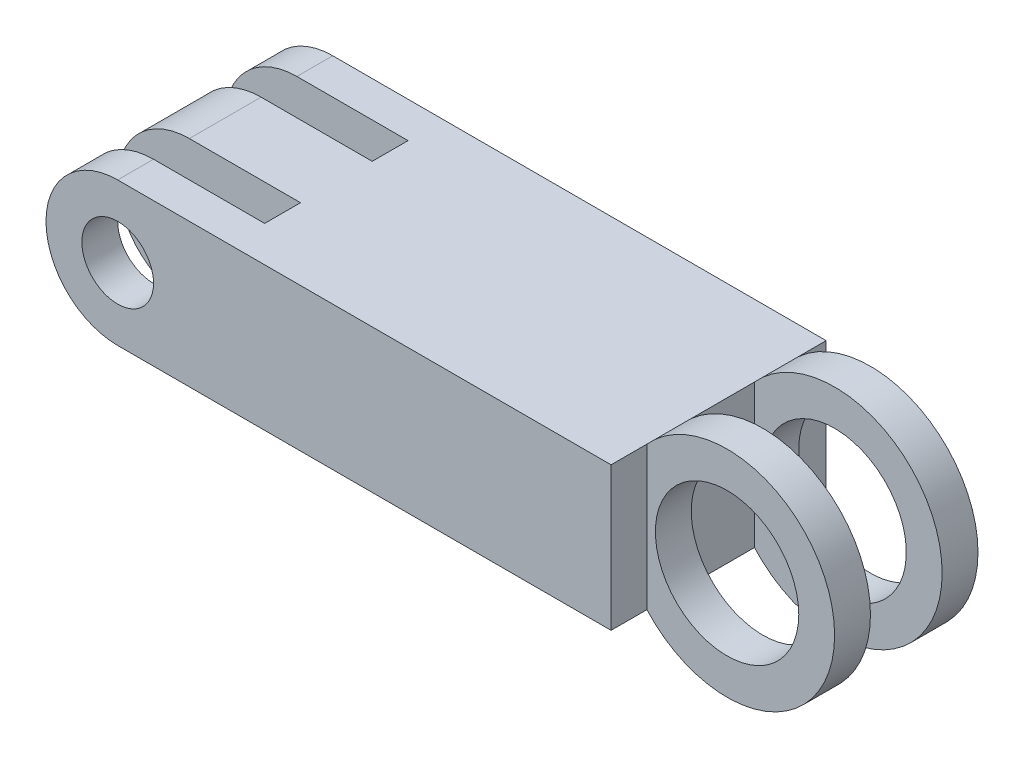
ISO-10303-21;
HEADER;
FILE_DESCRIPTION(('STEP AP214'),'2;1');
FILE_NAME('part.step','',(''),(''),'','','');
FILE_SCHEMA(('AUTOMOTIVE_DESIGN { 1 0 10303 214 1 1 1 1 }'));
ENDSEC;
DATA;
#1=APPLICATION_CONTEXT('core data for automotive mechanical design processes');
#2=APPLICATION_PROTOCOL_DEFINITION('international standard','automotive_design',2000,#1);
#3=PRODUCT_CONTEXT('',#1,'mechanical');
#4=PRODUCT('Part','Part','',(#3));
#5=PRODUCT_RELATED_PRODUCT_CATEGORY('part','',(#4));
#6=PRODUCT_DEFINITION_FORMATION('','',#4);
#7=PRODUCT_DEFINITION_CONTEXT('part definition',#1,'design');
#8=PRODUCT_DEFINITION('design','',#6,#7);
#9=PRODUCT_DEFINITION_SHAPE('','',#8);
#10=(LENGTH_UNIT() NAMED_UNIT(*) SI_UNIT(.MILLI.,.METRE.));
#11=(NAMED_UNIT(*) PLANE_ANGLE_UNIT() SI_UNIT($,.RADIAN.));
#12=(NAMED_UNIT(*) SI_UNIT($,.STERADIAN.) SOLID_ANGLE_UNIT());
#13=UNCERTAINTY_MEASURE_WITH_UNIT(LENGTH_MEASURE(1.E-05),#10,'distance_accuracy_value','');
#14=(GEOMETRIC_REPRESENTATION_CONTEXT(3) GLOBAL_UNCERTAINTY_ASSIGNED_CONTEXT((#13)) GLOBAL_UNIT_ASSIGNED_CONTEXT((#10,
#11,#12)) REPRESENTATION_CONTEXT('',''));
#15=CARTESIAN_POINT('',(0.,0.,0.));
#16=DIRECTION('',(0.,0.,1.));
#17=DIRECTION('',(1.,0.,0.));
#18=AXIS2_PLACEMENT_3D('',#15,#16,#17);
#19=CARTESIAN_POINT('',(87.4009683428763,12.7,38.1));
#20=DIRECTION('',(1.,0.,0.));
#21=DIRECTION('',(0.,0.,-1.));
#22=AXIS2_PLACEMENT_3D('',#19,#20,#21);
#23=PLANE('',#22);
#24=DIRECTION('',(0.,0.,-1.));
#25=VECTOR('',#24,1.);
#26=CARTESIAN_POINT('',(87.4009683428763,12.7,38.1));
#27=LINE('',#26,#25);
#28=CARTESIAN_POINT('',(87.4009683428763,12.7,25.4));
#29=VERTEX_POINT('',#28);
#30=CARTESIAN_POINT('',(87.4009683428763,12.7,12.7));
#31=VERTEX_POINT('',#30);
#32=EDGE_CURVE('E62',#29,#31,#27,.T.);
#33=ORIENTED_EDGE('',*,*,#32,.F.);
#34=DIRECTION('',(0.,-1.,0.));
#35=VECTOR('',#34,1.);
#36=CARTESIAN_POINT('',(87.4009683428763,12.7,25.4));
#37=LINE('',#36,#35);
#38=CARTESIAN_POINT('',(87.4009683428763,-12.7,25.4));
#39=VERTEX_POINT('',#38);
#40=EDGE_CURVE('E167',#29,#39,#37,.T.);
#41=ORIENTED_EDGE('',*,*,#40,.T.);
#42=DIRECTION('',(0.,0.,-1.));
#43=VECTOR('',#42,1.);
#44=CARTESIAN_POINT('',(87.4009683428763,-12.7,38.1));
#45=LINE('',#44,#43);
#46=CARTESIAN_POINT('',(87.4009683428763,-12.7,12.7));
#47=VERTEX_POINT('',#46);
#48=EDGE_CURVE('E156',#39,#47,#45,.T.);
#49=ORIENTED_EDGE('',*,*,#48,.T.);
#50=DIRECTION('',(0.,1.,0.));
#51=VECTOR('',#50,1.);
#52=CARTESIAN_POINT('',(87.4009683428763,12.7,12.7));
#53=LINE('',#52,#51);
#54=EDGE_CURVE('E52',#47,#31,#53,.T.);
#55=ORIENTED_EDGE('',*,*,#54,.T.);
#56=EDGE_LOOP('',(#33,#41,#49,#55));
#57=FACE_BOUND('',#56,.T.);
#58=ADVANCED_FACE('F42',(#57),#23,.T.);
#59=DIRECTION('',(0.,-1.,0.));
#60=VECTOR('',#59,1.);
#61=CARTESIAN_POINT('',(87.4009683428763,12.7,31.75));
#62=LINE('',#61,#60);
#63=CARTESIAN_POINT('',(87.4009683428763,12.7,31.75));
#64=VERTEX_POINT('',#63);
#65=CARTESIAN_POINT('',(87.4009683428763,-12.7,31.75));
#66=VERTEX_POINT('',#65);
#67=EDGE_CURVE('E68',#64,#66,#62,.T.);
#68=ORIENTED_EDGE('',*,*,#67,.F.);
#69=CARTESIAN_POINT('',(87.4009683428763,12.7,38.1));
#70=VERTEX_POINT('',#69);
#71=EDGE_CURVE('E322',#70,#64,#27,.T.);
#72=ORIENTED_EDGE('',*,*,#71,.F.);
#73=DIRECTION('',(0.,-1.,0.));
#74=VECTOR('',#73,1.);
#75=CARTESIAN_POINT('',(87.4009683428763,12.7,38.1));
#76=LINE('',#75,#74);
#77=CARTESIAN_POINT('',(87.4009683428763,-12.7,38.1));
#78=VERTEX_POINT('',#77);
#79=EDGE_CURVE('E400',#70,#78,#76,.T.);
#80=ORIENTED_EDGE('',*,*,#79,.T.);
#81=EDGE_CURVE('E166',#78,#66,#45,.T.);
#82=ORIENTED_EDGE('',*,*,#81,.T.);
#83=EDGE_LOOP('',(#68,#72,#80,#82));
#84=FACE_BOUND('',#83,.T.);
#85=ADVANCED_FACE('F298',(#84),#23,.T.);
#86=CARTESIAN_POINT('',(0.,0.,38.1));
#87=DIRECTION('',(0.,0.,-1.));
#88=DIRECTION('',(-1.,0.,0.));
#89=AXIS2_PLACEMENT_3D('',#86,#87,#88);
#90=CYLINDRICAL_SURFACE('',#89,12.7);
#91=CARTESIAN_POINT('',(0.,0.,31.75));
#92=DIRECTION('',(0.,0.,-1.));
#93=DIRECTION('',(-1.,0.,0.));
#94=AXIS2_PLACEMENT_3D('',#91,#92,#93);
#95=CIRCLE('',#94,12.7);
#96=CARTESIAN_POINT('',(0.,-12.7,31.75));
#97=VERTEX_POINT('',#96);
#98=CARTESIAN_POINT('',(0.,12.7,31.75));
#99=VERTEX_POINT('',#98);
#100=EDGE_CURVE('E363',#97,#99,#95,.T.);
#101=ORIENTED_EDGE('',*,*,#100,.F.);
#102=DIRECTION('',(0.,0.,-1.));
#103=VECTOR('',#102,1.);
#104=CARTESIAN_POINT('',(0.,-12.7,38.1));
#105=LINE('',#104,#103);
#106=CARTESIAN_POINT('',(0.,-12.7,38.1));
#107=VERTEX_POINT('',#106);
#108=EDGE_CURVE('E329',#107,#97,#105,.T.);
#109=ORIENTED_EDGE('',*,*,#108,.F.);
#110=CARTESIAN_POINT('',(0.,0.,38.1));
#111=DIRECTION('',(0.,0.,1.));
#112=DIRECTION('',(1.,0.,0.));
#113=AXIS2_PLACEMENT_3D('',#110,#111,#112);
#114=CIRCLE('',#113,12.7);
#115=CARTESIAN_POINT('',(0.,12.7,38.1));
#116=VERTEX_POINT('',#115);
#117=EDGE_CURVE('E403',#116,#107,#114,.T.);
#118=ORIENTED_EDGE('',*,*,#117,.F.);
#119=DIRECTION('',(0.,0.,-1.));
#120=VECTOR('',#119,1.);
#121=CARTESIAN_POINT('',(0.,12.7,38.1));
#122=LINE('',#121,#120);
#123=EDGE_CURVE('E335',#116,#99,#122,.T.);
#124=ORIENTED_EDGE('',*,*,#123,.T.);
#125=EDGE_LOOP('',(#101,#109,#118,#124));
#126=FACE_BOUND('',#125,.T.);
#127=ADVANCED_FACE('F297',(#126),#90,.T.);
#128=CARTESIAN_POINT('',(0.,0.,6.35));
#129=DIRECTION('',(0.,0.,1.));
#130=DIRECTION('',(1.,0.,0.));
#131=AXIS2_PLACEMENT_3D('',#128,#129,#130);
#132=CIRCLE('',#131,12.7);
#133=CARTESIAN_POINT('',(0.,12.7,6.35));
#134=VERTEX_POINT('',#133);
#135=CARTESIAN_POINT('',(0.,-12.7,6.35000000000002));
#136=VERTEX_POINT('',#135);
#137=EDGE_CURVE('E378',#134,#136,#132,.T.);
#138=ORIENTED_EDGE('',*,*,#137,.F.);
#139=CARTESIAN_POINT('',(0.,12.7,0.));
#140=VERTEX_POINT('',#139);
#141=EDGE_CURVE('E412',#134,#140,#122,.T.);
#142=ORIENTED_EDGE('',*,*,#141,.T.);
#143=CARTESIAN_POINT('',(0.,0.,0.));
#144=DIRECTION('',(0.,0.,1.));
#145=DIRECTION('',(1.,0.,0.));
#146=AXIS2_PLACEMENT_3D('',#143,#144,#145);
#147=CIRCLE('',#146,12.7);
#148=CARTESIAN_POINT('',(0.,-12.7,0.));
#149=VERTEX_POINT('',#148);
#150=EDGE_CURVE('E396',#140,#149,#147,.T.);
#151=ORIENTED_EDGE('',*,*,#150,.T.);
#152=EDGE_CURVE('E323',#136,#149,#105,.T.);
#153=ORIENTED_EDGE('',*,*,#152,.F.);
#154=EDGE_LOOP('',(#138,#142,#151,#153));
#155=FACE_BOUND('',#154,.T.);
#156=ADVANCED_FACE('F430',(#155),#90,.T.);
#157=CARTESIAN_POINT('',(0.,12.7,38.1));
#158=DIRECTION('',(0.,1.,0.));
#159=DIRECTION('',(-1.,0.,0.));
#160=AXIS2_PLACEMENT_3D('',#157,#158,#159);
#161=PLANE('',#160);
#162=DIRECTION('',(-1.,0.,0.));
#163=VECTOR('',#162,1.);
#164=CARTESIAN_POINT('',(0.,12.7,25.4));
#165=LINE('',#164,#163);
#166=CARTESIAN_POINT('',(19.685,12.7,25.4));
#167=VERTEX_POINT('',#166);
#168=CARTESIAN_POINT('',(0.,12.7,25.4));
#169=VERTEX_POINT('',#168);
#170=EDGE_CURVE('E371',#167,#169,#165,.T.);
#171=ORIENTED_EDGE('',*,*,#170,.F.);
#172=DIRECTION('',(0.,0.,-1.));
#173=VECTOR('',#172,1.);
#174=CARTESIAN_POINT('',(19.685,12.7,38.1));
#175=LINE('',#174,#173);
#176=CARTESIAN_POINT('',(19.685,12.7,31.75));
#177=VERTEX_POINT('',#176);
#178=EDGE_CURVE('E373',#177,#167,#175,.T.);
#179=ORIENTED_EDGE('',*,*,#178,.F.);
#180=DIRECTION('',(-1.,0.,0.));
#181=VECTOR('',#180,1.);
#182=CARTESIAN_POINT('',(0.,12.7,31.75));
#183=LINE('',#182,#181);
#184=EDGE_CURVE('E362',#177,#99,#183,.T.);
#185=ORIENTED_EDGE('',*,*,#184,.T.);
#186=ORIENTED_EDGE('',*,*,#123,.F.);
#187=DIRECTION('',(1.,0.,0.));
#188=VECTOR('',#187,1.);
#189=CARTESIAN_POINT('',(0.,12.7,38.1));
#190=LINE('',#189,#188);
#191=EDGE_CURVE('E392',#116,#70,#190,.T.);
#192=ORIENTED_EDGE('',*,*,#191,.T.);
#193=ORIENTED_EDGE('',*,*,#71,.T.);
#194=DIRECTION('',(0.,0.,-1.));
#195=VECTOR('',#194,1.);
#196=CARTESIAN_POINT('',(87.4009683428763,12.7,31.75));
#197=LINE('',#196,#195);
#198=EDGE_CURVE('E192',#29,#64,#197,.F.);
#199=ORIENTED_EDGE('',*,*,#198,.F.);
#200=ORIENTED_EDGE('',*,*,#32,.T.);
#201=CARTESIAN_POINT('',(87.4009683428763,12.7,6.35));
#202=VERTEX_POINT('',#201);
#203=EDGE_CURVE('E324',#31,#202,#27,.T.);
#204=ORIENTED_EDGE('',*,*,#203,.T.);
#205=CARTESIAN_POINT('',(87.4009683428763,12.7,0.));
#206=VERTEX_POINT('',#205);
#207=EDGE_CURVE('E313',#202,#206,#27,.T.);
#208=ORIENTED_EDGE('',*,*,#207,.T.);
#209=DIRECTION('',(1.,0.,0.));
#210=VECTOR('',#209,1.);
#211=CARTESIAN_POINT('',(0.,12.7,0.));
#212=LINE('',#211,#210);
#213=EDGE_CURVE('E393',#140,#206,#212,.T.);
#214=ORIENTED_EDGE('',*,*,#213,.F.);
#215=ORIENTED_EDGE('',*,*,#141,.F.);
#216=DIRECTION('',(1.,0.,0.));
#217=VECTOR('',#216,1.);
#218=CARTESIAN_POINT('',(0.,12.7,6.35));
#219=LINE('',#218,#217);
#220=CARTESIAN_POINT('',(19.685,12.7,6.35));
#221=VERTEX_POINT('',#220);
#222=EDGE_CURVE('E384',#134,#221,#219,.T.);
#223=ORIENTED_EDGE('',*,*,#222,.T.);
#224=DIRECTION('',(0.,0.,1.));
#225=VECTOR('',#224,1.);
#226=CARTESIAN_POINT('',(19.685,12.7,38.1));
#227=LINE('',#226,#225);
#228=CARTESIAN_POINT('',(19.685,12.7,12.7));
#229=VERTEX_POINT('',#228);
#230=EDGE_CURVE('E394',#221,#229,#227,.T.);
#231=ORIENTED_EDGE('',*,*,#230,.T.);
#232=DIRECTION('',(1.,0.,0.));
#233=VECTOR('',#232,1.);
#234=CARTESIAN_POINT('',(0.,12.7,12.7));
#235=LINE('',#234,#233);
#236=CARTESIAN_POINT('',(0.,12.7,12.7));
#237=VERTEX_POINT('',#236);
#238=EDGE_CURVE('E386',#237,#229,#235,.T.);
#239=ORIENTED_EDGE('',*,*,#238,.F.);
#240=EDGE_CURVE('E413',#169,#237,#122,.T.);
#241=ORIENTED_EDGE('',*,*,#240,.F.);
#242=EDGE_LOOP('',(#171,#179,#185,#186,#192,#193,#199,#200,#204,#208,#214,#215,#223,#231,#239,#241));
#243=FACE_BOUND('',#242,.T.);
#244=ADVANCED_FACE('F46',(#243),#161,.T.);
#245=CARTESIAN_POINT('',(0.,-12.7,25.4));
#246=VERTEX_POINT('',#245);
#247=CARTESIAN_POINT('',(0.,-12.7,12.7));
#248=VERTEX_POINT('',#247);
#249=EDGE_CURVE('E425',#246,#248,#105,.T.);
#250=ORIENTED_EDGE('',*,*,#249,.F.);
#251=CARTESIAN_POINT('',(0.,0.,25.4));
#252=DIRECTION('',(0.,0.,-1.));
#253=DIRECTION('',(-1.,0.,0.));
#254=AXIS2_PLACEMENT_3D('',#251,#252,#253);
#255=CIRCLE('',#254,12.7);
#256=EDGE_CURVE('E368',#246,#169,#255,.T.);
#257=ORIENTED_EDGE('',*,*,#256,.T.);
#258=ORIENTED_EDGE('',*,*,#240,.T.);
#259=CARTESIAN_POINT('',(0.,0.,12.7));
#260=DIRECTION('',(0.,0.,1.));
#261=DIRECTION('',(1.,0.,0.));
#262=AXIS2_PLACEMENT_3D('',#259,#260,#261);
#263=CIRCLE('',#262,12.7);
#264=EDGE_CURVE('E387',#237,#248,#263,.T.);
#265=ORIENTED_EDGE('',*,*,#264,.T.);
#266=EDGE_LOOP('',(#250,#257,#258,#265));
#267=FACE_BOUND('',#266,.T.);
#268=ADVANCED_FACE('F307',(#267),#90,.T.);
#269=CARTESIAN_POINT('',(87.4009683428763,-12.7,38.1));
#270=DIRECTION('',(0.,-1.,0.));
#271=DIRECTION('',(1.,0.,0.));
#272=AXIS2_PLACEMENT_3D('',#269,#270,#271);
#273=PLANE('',#272);
#274=DIRECTION('',(1.,0.,0.));
#275=VECTOR('',#274,1.);
#276=CARTESIAN_POINT('',(87.4009683428763,-12.7,25.4));
#277=LINE('',#276,#275);
#278=CARTESIAN_POINT('',(19.685,-12.7,25.4));
#279=VERTEX_POINT('',#278);
#280=EDGE_CURVE('E277',#246,#279,#277,.T.);
#281=ORIENTED_EDGE('',*,*,#280,.F.);
#282=ORIENTED_EDGE('',*,*,#249,.T.);
#283=DIRECTION('',(-1.,0.,0.));
#284=VECTOR('',#283,1.);
#285=CARTESIAN_POINT('',(87.4009683428763,-12.7,12.7));
#286=LINE('',#285,#284);
#287=CARTESIAN_POINT('',(19.685,-12.7,12.7));
#288=VERTEX_POINT('',#287);
#289=EDGE_CURVE('E337',#288,#248,#286,.T.);
#290=ORIENTED_EDGE('',*,*,#289,.F.);
#291=DIRECTION('',(0.,0.,-1.));
#292=VECTOR('',#291,1.);
#293=CARTESIAN_POINT('',(19.685,-12.7,38.1));
#294=LINE('',#293,#292);
#295=CARTESIAN_POINT('',(19.685,-12.7,6.35));
#296=VERTEX_POINT('',#295);
#297=EDGE_CURVE('E334',#288,#296,#294,.T.);
#298=ORIENTED_EDGE('',*,*,#297,.T.);
#299=DIRECTION('',(-1.,0.,0.));
#300=VECTOR('',#299,1.);
#301=CARTESIAN_POINT('',(87.4009683428763,-12.7,6.35));
#302=LINE('',#301,#300);
#303=EDGE_CURVE('E328',#296,#136,#302,.T.);
#304=ORIENTED_EDGE('',*,*,#303,.T.);
#305=ORIENTED_EDGE('',*,*,#152,.T.);
#306=DIRECTION('',(-1.,0.,0.));
#307=VECTOR('',#306,1.);
#308=CARTESIAN_POINT('',(87.4009683428763,-12.7,0.));
#309=LINE('',#308,#307);
#310=CARTESIAN_POINT('',(87.4009683428763,-12.7,0.));
#311=VERTEX_POINT('',#310);
#312=EDGE_CURVE('E316',#311,#149,#309,.T.);
#313=ORIENTED_EDGE('',*,*,#312,.F.);
#314=CARTESIAN_POINT('',(87.4009683428763,-12.7,6.35));
#315=VERTEX_POINT('',#314);
#316=EDGE_CURVE('E185',#315,#311,#45,.T.);
#317=ORIENTED_EDGE('',*,*,#316,.F.);
#318=EDGE_CURVE('E164',#47,#315,#45,.T.);
#319=ORIENTED_EDGE('',*,*,#318,.F.);
#320=ORIENTED_EDGE('',*,*,#48,.F.);
#321=EDGE_CURVE('E161',#66,#39,#45,.T.);
#322=ORIENTED_EDGE('',*,*,#321,.F.);
#323=ORIENTED_EDGE('',*,*,#81,.F.);
#324=DIRECTION('',(-1.,0.,0.));
#325=VECTOR('',#324,1.);
#326=CARTESIAN_POINT('',(87.4009683428763,-12.7,38.1));
#327=LINE('',#326,#325);
#328=EDGE_CURVE('E405',#78,#107,#327,.T.);
#329=ORIENTED_EDGE('',*,*,#328,.T.);
#330=ORIENTED_EDGE('',*,*,#108,.T.);
#331=DIRECTION('',(1.,0.,0.));
#332=VECTOR('',#331,1.);
#333=CARTESIAN_POINT('',(87.4009683428763,-12.7,31.75));
#334=LINE('',#333,#332);
#335=CARTESIAN_POINT('',(19.685,-12.7,31.75));
#336=VERTEX_POINT('',#335);
#337=EDGE_CURVE('E339',#97,#336,#334,.T.);
#338=ORIENTED_EDGE('',*,*,#337,.T.);
#339=DIRECTION('',(0.,0.,1.));
#340=VECTOR('',#339,1.);
#341=CARTESIAN_POINT('',(19.685,-12.7,38.1));
#342=LINE('',#341,#340);
#343=EDGE_CURVE('E345',#279,#336,#342,.T.);
#344=ORIENTED_EDGE('',*,*,#343,.F.);
#345=EDGE_LOOP('',(#281,#282,#290,#298,#304,#305,#313,#317,#319,#320,#322,#323,#329,#330,#338,#344));
#346=FACE_BOUND('',#345,.T.);
#347=ADVANCED_FACE('F163',(#346),#273,.T.);
#348=DIRECTION('',(0.,1.,0.));
#349=VECTOR('',#348,1.);
#350=CARTESIAN_POINT('',(87.4009683428763,12.7,6.35));
#351=LINE('',#350,#349);
#352=EDGE_CURVE('E11',#315,#202,#351,.T.);
#353=ORIENTED_EDGE('',*,*,#352,.F.);
#354=ORIENTED_EDGE('',*,*,#316,.T.);
#355=DIRECTION('',(0.,-1.,0.));
#356=VECTOR('',#355,1.);
#357=CARTESIAN_POINT('',(87.4009683428763,12.7,0.));
#358=LINE('',#357,#356);
#359=EDGE_CURVE('E406',#206,#311,#358,.T.);
#360=ORIENTED_EDGE('',*,*,#359,.F.);
#361=ORIENTED_EDGE('',*,*,#207,.F.);
#362=EDGE_LOOP('',(#353,#354,#360,#361));
#363=FACE_BOUND('',#362,.T.);
#364=ADVANCED_FACE('F261',(#363),#23,.T.);
#365=CARTESIAN_POINT('',(0.,0.,38.1));
#366=DIRECTION('',(0.,0.,1.));
#367=DIRECTION('',(1.,0.,0.));
#368=AXIS2_PLACEMENT_3D('',#365,#366,#367);
#369=PLANE('',#368);
#370=CARTESIAN_POINT('',(0.,0.,38.100012));
#371=DIRECTION('',(0.,0.,1.));
#372=DIRECTION('',(1.,0.,0.));
#373=AXIS2_PLACEMENT_3D('',#370,#371,#372);
#374=CIRCLE('',#373,6.35);
#375=CARTESIAN_POINT('',(6.35,0.,38.100012));
#376=VERTEX_POINT('',#375);
#377=EDGE_CURVE('E202',#376,#376,#374,.T.);
#378=ORIENTED_EDGE('',*,*,#377,.F.);
#379=EDGE_LOOP('',(#378));
#380=FACE_BOUND('',#379,.T.);
#381=ORIENTED_EDGE('',*,*,#191,.F.);
#382=ORIENTED_EDGE('',*,*,#117,.T.);
#383=ORIENTED_EDGE('',*,*,#328,.F.);
#384=ORIENTED_EDGE('',*,*,#79,.F.);
#385=EDGE_LOOP('',(#381,#382,#383,#384));
#386=FACE_BOUND('',#385,.T.);
#387=ADVANCED_FACE('F259',(#380,#386),#369,.T.);
#388=CARTESIAN_POINT('',(0.,0.,0.));
#389=DIRECTION('',(0.,0.,1.));
#390=DIRECTION('',(1.,0.,0.));
#391=AXIS2_PLACEMENT_3D('',#388,#389,#390);
#392=PLANE('',#391);
#393=CARTESIAN_POINT('',(0.,0.,0.));
#394=DIRECTION('',(0.,0.,1.));
#395=DIRECTION('',(1.,0.,0.));
#396=AXIS2_PLACEMENT_3D('',#393,#394,#395);
#397=CIRCLE('',#396,6.35);
#398=CARTESIAN_POINT('',(6.35,0.,0.));
#399=VERTEX_POINT('',#398);
#400=EDGE_CURVE('E201',#399,#399,#397,.T.);
#401=ORIENTED_EDGE('',*,*,#400,.T.);
#402=EDGE_LOOP('',(#401));
#403=FACE_BOUND('',#402,.T.);
#404=ORIENTED_EDGE('',*,*,#213,.T.);
#405=ORIENTED_EDGE('',*,*,#359,.T.);
#406=ORIENTED_EDGE('',*,*,#312,.T.);
#407=ORIENTED_EDGE('',*,*,#150,.F.);
#408=EDGE_LOOP('',(#404,#405,#406,#407));
#409=FACE_BOUND('',#408,.T.);
#410=ADVANCED_FACE('F257',(#403,#409),#392,.F.);
#411=CARTESIAN_POINT('',(19.685,-19.685,12.7));
#412=DIRECTION('',(-1.,0.,0.));
#413=DIRECTION('',(0.,0.,1.));
#414=AXIS2_PLACEMENT_3D('',#411,#412,#413);
#415=PLANE('',#414);
#416=DIRECTION('',(0.,1.,0.));
#417=VECTOR('',#416,1.);
#418=CARTESIAN_POINT('',(19.685,-19.685,6.35));
#419=LINE('',#418,#417);
#420=EDGE_CURVE('E374',#296,#221,#419,.T.);
#421=ORIENTED_EDGE('',*,*,#420,.F.);
#422=ORIENTED_EDGE('',*,*,#297,.F.);
#423=DIRECTION('',(0.,1.,0.));
#424=VECTOR('',#423,1.);
#425=CARTESIAN_POINT('',(19.685,-19.685,12.7));
#426=LINE('',#425,#424);
#427=EDGE_CURVE('E376',#288,#229,#426,.T.);
#428=ORIENTED_EDGE('',*,*,#427,.T.);
#429=ORIENTED_EDGE('',*,*,#230,.F.);
#430=EDGE_LOOP('',(#421,#422,#428,#429));
#431=FACE_BOUND('',#430,.T.);
#432=ADVANCED_FACE('F248',(#431),#415,.T.);
#433=CARTESIAN_POINT('',(0.,0.,12.7));
#434=DIRECTION('',(0.,0.,1.));
#435=DIRECTION('',(1.,0.,0.));
#436=AXIS2_PLACEMENT_3D('',#433,#434,#435);
#437=PLANE('',#436);
#438=CARTESIAN_POINT('',(0.,0.,12.7));
#439=DIRECTION('',(0.,0.,1.));
#440=DIRECTION('',(1.,0.,0.));
#441=AXIS2_PLACEMENT_3D('',#438,#439,#440);
#442=CIRCLE('',#441,6.35);
#443=CARTESIAN_POINT('',(6.35,0.,12.7));
#444=VERTEX_POINT('',#443);
#445=EDGE_CURVE('E352',#444,#444,#442,.T.);
#446=ORIENTED_EDGE('',*,*,#445,.T.);
#447=EDGE_LOOP('',(#446));
#448=FACE_BOUND('',#447,.T.);
#449=ORIENTED_EDGE('',*,*,#238,.T.);
#450=ORIENTED_EDGE('',*,*,#427,.F.);
#451=ORIENTED_EDGE('',*,*,#289,.T.);
#452=ORIENTED_EDGE('',*,*,#264,.F.);
#453=EDGE_LOOP('',(#449,#450,#451,#452));
#454=FACE_BOUND('',#453,.T.);
#455=ADVANCED_FACE('F246',(#448,#454),#437,.F.);
#456=CARTESIAN_POINT('',(0.,0.,6.35));
#457=DIRECTION('',(0.,0.,1.));
#458=DIRECTION('',(1.,0.,0.));
#459=AXIS2_PLACEMENT_3D('',#456,#457,#458);
#460=PLANE('',#459);
#461=CARTESIAN_POINT('',(0.,0.,6.35));
#462=DIRECTION('',(0.,0.,1.));
#463=DIRECTION('',(1.,0.,0.));
#464=AXIS2_PLACEMENT_3D('',#461,#462,#463);
#465=CIRCLE('',#464,6.35);
#466=CARTESIAN_POINT('',(6.35,0.,6.35));
#467=VERTEX_POINT('',#466);
#468=EDGE_CURVE('E350',#467,#467,#465,.T.);
#469=ORIENTED_EDGE('',*,*,#468,.F.);
#470=EDGE_LOOP('',(#469));
#471=FACE_BOUND('',#470,.T.);
#472=ORIENTED_EDGE('',*,*,#137,.T.);
#473=ORIENTED_EDGE('',*,*,#303,.F.);
#474=ORIENTED_EDGE('',*,*,#420,.T.);
#475=ORIENTED_EDGE('',*,*,#222,.F.);
#476=EDGE_LOOP('',(#472,#473,#474,#475));
#477=FACE_BOUND('',#476,.T.);
#478=ADVANCED_FACE('F242',(#471,#477),#460,.T.);
#479=CARTESIAN_POINT('',(19.685,-19.685,25.4));
#480=DIRECTION('',(1.,0.,0.));
#481=DIRECTION('',(0.,0.,-1.));
#482=AXIS2_PLACEMENT_3D('',#479,#480,#481);
#483=PLANE('',#482);
#484=ORIENTED_EDGE('',*,*,#178,.T.);
#485=DIRECTION('',(0.,1.,0.));
#486=VECTOR('',#485,1.);
#487=CARTESIAN_POINT('',(19.685,-19.685,25.4));
#488=LINE('',#487,#486);
#489=EDGE_CURVE('E356',#279,#167,#488,.T.);
#490=ORIENTED_EDGE('',*,*,#489,.F.);
#491=ORIENTED_EDGE('',*,*,#343,.T.);
#492=DIRECTION('',(0.,1.,0.));
#493=VECTOR('',#492,1.);
#494=CARTESIAN_POINT('',(19.685,-19.685,31.75));
#495=LINE('',#494,#493);
#496=EDGE_CURVE('E353',#336,#177,#495,.T.);
#497=ORIENTED_EDGE('',*,*,#496,.T.);
#498=EDGE_LOOP('',(#484,#490,#491,#497));
#499=FACE_BOUND('',#498,.T.);
#500=ADVANCED_FACE('F240',(#499),#483,.F.);
#501=CARTESIAN_POINT('',(0.,0.,25.4));
#502=DIRECTION('',(0.,0.,-1.));
#503=DIRECTION('',(1.,0.,0.));
#504=AXIS2_PLACEMENT_3D('',#501,#502,#503);
#505=PLANE('',#504);
#506=CARTESIAN_POINT('',(0.,0.,25.4));
#507=DIRECTION('',(0.,0.,-1.));
#508=DIRECTION('',(-1.,0.,0.));
#509=AXIS2_PLACEMENT_3D('',#506,#507,#508);
#510=CIRCLE('',#509,6.35);
#511=CARTESIAN_POINT('',(6.35,0.,25.4));
#512=VERTEX_POINT('',#511);
#513=EDGE_CURVE('E219',#512,#512,#510,.T.);
#514=ORIENTED_EDGE('',*,*,#513,.T.);
#515=EDGE_LOOP('',(#514));
#516=FACE_BOUND('',#515,.T.);
#517=ORIENTED_EDGE('',*,*,#170,.T.);
#518=ORIENTED_EDGE('',*,*,#256,.F.);
#519=ORIENTED_EDGE('',*,*,#280,.T.);
#520=ORIENTED_EDGE('',*,*,#489,.T.);
#521=EDGE_LOOP('',(#517,#518,#519,#520));
#522=FACE_BOUND('',#521,.T.);
#523=ADVANCED_FACE('F234',(#516,#522),#505,.F.);
#524=CARTESIAN_POINT('',(0.,0.,31.75));
#525=DIRECTION('',(0.,0.,-1.));
#526=DIRECTION('',(1.,0.,0.));
#527=AXIS2_PLACEMENT_3D('',#524,#525,#526);
#528=PLANE('',#527);
#529=CARTESIAN_POINT('',(0.,0.,31.75));
#530=DIRECTION('',(0.,0.,-1.));
#531=DIRECTION('',(-1.,0.,0.));
#532=AXIS2_PLACEMENT_3D('',#529,#530,#531);
#533=CIRCLE('',#532,6.35);
#534=CARTESIAN_POINT('',(-6.35,0.,31.75));
#535=VERTEX_POINT('',#534);
#536=EDGE_CURVE('E210',#535,#535,#533,.T.);
#537=ORIENTED_EDGE('',*,*,#536,.F.);
#538=EDGE_LOOP('',(#537));
#539=FACE_BOUND('',#538,.T.);
#540=ORIENTED_EDGE('',*,*,#496,.F.);
#541=ORIENTED_EDGE('',*,*,#337,.F.);
#542=ORIENTED_EDGE('',*,*,#100,.T.);
#543=ORIENTED_EDGE('',*,*,#184,.F.);
#544=EDGE_LOOP('',(#540,#541,#542,#543));
#545=FACE_BOUND('',#544,.T.);
#546=ADVANCED_FACE('F230',(#539,#545),#528,.T.);
#547=CARTESIAN_POINT('',(0.,0.,0.));
#548=DIRECTION('',(0.,0.,1.));
#549=DIRECTION('',(1.,0.,0.));
#550=AXIS2_PLACEMENT_3D('',#547,#548,#549);
#551=CYLINDRICAL_SURFACE('',#550,6.35);
#552=ORIENTED_EDGE('',*,*,#536,.T.);
#553=EDGE_LOOP('',(#552));
#554=FACE_BOUND('',#553,.T.);
#555=ORIENTED_EDGE('',*,*,#377,.T.);
#556=EDGE_LOOP('',(#555));
#557=FACE_BOUND('',#556,.T.);
#558=ADVANCED_FACE('F220',(#554,#557),#551,.F.);
#559=CARTESIAN_POINT('',(6.35,0.,25.4));
#560=CARTESIAN_POINT('',(6.35,0.,25.2677083333333));
#561=CARTESIAN_POINT('',(6.35,0.,25.1354166666667));
#562=CARTESIAN_POINT('',(6.35,0.,24.8708333333333));
#563=CARTESIAN_POINT('',(6.35,0.,24.7385416666667));
#564=CARTESIAN_POINT('',(6.35,0.,24.4739583333333));
#565=CARTESIAN_POINT('',(6.35,0.,24.3416666666667));
#566=CARTESIAN_POINT('',(6.35,0.,24.0770833333333));
#567=CARTESIAN_POINT('',(6.35,0.,23.9447916666667));
#568=CARTESIAN_POINT('',(6.35,0.,23.6802083333333));
#569=CARTESIAN_POINT('',(6.35,0.,23.5479166666667));
#570=CARTESIAN_POINT('',(6.35,0.,23.2833333333333));
#571=CARTESIAN_POINT('',(6.35,0.,23.1510416666667));
#572=CARTESIAN_POINT('',(6.35,0.,22.8864583333333));
#573=CARTESIAN_POINT('',(6.35,0.,22.7541666666667));
#574=CARTESIAN_POINT('',(6.35,0.,22.4895833333333));
#575=CARTESIAN_POINT('',(6.35,0.,22.3572916666667));
#576=CARTESIAN_POINT('',(6.35,0.,22.0927083333333));
#577=CARTESIAN_POINT('',(6.35,0.,21.9604166666667));
#578=CARTESIAN_POINT('',(6.35,0.,21.6958333333333));
#579=CARTESIAN_POINT('',(6.35,0.,21.5635416666667));
#580=CARTESIAN_POINT('',(6.35,0.,21.2989583333333));
#581=CARTESIAN_POINT('',(6.35,0.,21.1666666666667));
#582=CARTESIAN_POINT('',(6.35,0.,20.9020833333333));
#583=CARTESIAN_POINT('',(6.35,0.,20.7697916666667));
#584=CARTESIAN_POINT('',(6.35,0.,20.5052083333333));
#585=CARTESIAN_POINT('',(6.35,0.,20.3729166666667));
#586=CARTESIAN_POINT('',(6.35,0.,20.1083333333333));
#587=CARTESIAN_POINT('',(6.35,0.,19.9760416666667));
#588=CARTESIAN_POINT('',(6.35,0.,19.7114583333333));
#589=CARTESIAN_POINT('',(6.35,0.,19.5791666666667));
#590=CARTESIAN_POINT('',(6.35,0.,19.3145833333333));
#591=CARTESIAN_POINT('',(6.35,0.,19.1822916666667));
#592=CARTESIAN_POINT('',(6.35,0.,18.9177083333333));
#593=CARTESIAN_POINT('',(6.35,0.,18.7854166666667));
#594=CARTESIAN_POINT('',(6.35,0.,18.5208333333333));
#595=CARTESIAN_POINT('',(6.35,0.,18.3885416666667));
#596=CARTESIAN_POINT('',(6.35,0.,18.1239583333333));
#597=CARTESIAN_POINT('',(6.35,0.,17.9916666666667));
#598=CARTESIAN_POINT('',(6.35,0.,17.7270833333333));
#599=CARTESIAN_POINT('',(6.35,0.,17.5947916666667));
#600=CARTESIAN_POINT('',(6.35,0.,17.3302083333333));
#601=CARTESIAN_POINT('',(6.35,0.,17.1979166666667));
#602=CARTESIAN_POINT('',(6.35,0.,16.9333333333333));
#603=CARTESIAN_POINT('',(6.35,0.,16.8010416666667));
#604=CARTESIAN_POINT('',(6.35,0.,16.5364583333333));
#605=CARTESIAN_POINT('',(6.35,0.,16.4041666666667));
#606=CARTESIAN_POINT('',(6.35,0.,16.1395833333333));
#607=CARTESIAN_POINT('',(6.35,0.,16.0072916666667));
#608=CARTESIAN_POINT('',(6.35,0.,15.7427083333333));
#609=CARTESIAN_POINT('',(6.35,0.,15.6104166666667));
#610=CARTESIAN_POINT('',(6.35,0.,15.3458333333333));
#611=CARTESIAN_POINT('',(6.35,0.,15.2135416666667));
#612=CARTESIAN_POINT('',(6.35,0.,14.9489583333333));
#613=CARTESIAN_POINT('',(6.35,0.,14.8166666666667));
#614=CARTESIAN_POINT('',(6.35,0.,14.5520833333333));
#615=CARTESIAN_POINT('',(6.35,0.,14.4197916666667));
#616=CARTESIAN_POINT('',(6.35,0.,14.1552083333333));
#617=CARTESIAN_POINT('',(6.35,0.,14.0229166666667));
#618=CARTESIAN_POINT('',(6.35,0.,13.7583333333333));
#619=CARTESIAN_POINT('',(6.35,0.,13.6260416666667));
#620=CARTESIAN_POINT('',(6.35,0.,13.3614583333333));
#621=CARTESIAN_POINT('',(6.35,0.,13.2291666666667));
#622=CARTESIAN_POINT('',(6.35,0.,12.9645833333333));
#623=CARTESIAN_POINT('',(6.35,0.,12.8322916666667));
#624=CARTESIAN_POINT('',(6.35,0.,12.7));
#625=B_SPLINE_CURVE_WITH_KNOTS('',3,(#559,#560,#561,#562,#563,#564,#565,#566,#567,#568,#569,
#570,#571,#572,#573,#574,#575,#576,#577,#578,#579,#580,#581,#582,#583,#584,#585,#586,#587,#588,
#589,#590,#591,#592,#593,#594,#595,#596,#597,#598,#599,#600,#601,#602,#603,#604,#605,#606,#607,
#608,#609,#610,#611,#612,#613,#614,#615,#616,#617,#618,#619,#620,#621,#622,#623,#624),
.UNSPECIFIED.,.F.,.F.,(4,2,2,2,2,2,2,2,2,2,2,2,2,2,2,2,2,2,2,2,2,2,2,2,2,2,2,2,2,2,2,2,4),(0.,
0.396875000000001,0.793749999999999,1.190625,1.5875,1.984375,2.38125,2.778125,3.175,3.571875,
3.96875,4.365625,4.7625,5.159375,5.55625,5.953125,6.35,6.746875,7.14375,7.540625,7.9375,
8.334375,8.73125,9.128125,9.52500000000001,9.921875,10.31875,10.715625,11.1125,11.509375,
11.90625,12.303125,12.7),.UNSPECIFIED.);
#626=EDGE_CURVE('BSEAM226',#512,#444,#625,.T.);
#627=ORIENTED_EDGE('',*,*,#513,.F.);
#628=ORIENTED_EDGE('',*,*,#445,.F.);
#629=ORIENTED_EDGE('',*,*,#626,.T.);
#630=ORIENTED_EDGE('',*,*,#626,.F.);
#631=EDGE_LOOP('',(#627,#629,#628,#630));
#632=FACE_BOUND('',#631,.T.);
#633=ADVANCED_FACE('F226',(#632),#551,.F.);
#634=CARTESIAN_POINT('',(6.35,0.,6.35));
#635=CARTESIAN_POINT('',(6.35,0.,6.28385416666667));
#636=CARTESIAN_POINT('',(6.35,0.,6.21770833333333));
#637=CARTESIAN_POINT('',(6.35,0.,6.08541666666667));
#638=CARTESIAN_POINT('',(6.35,0.,6.01927083333333));
#639=CARTESIAN_POINT('',(6.35,0.,5.88697916666667));
#640=CARTESIAN_POINT('',(6.35,0.,5.82083333333333));
#641=CARTESIAN_POINT('',(6.35,0.,5.68854166666667));
#642=CARTESIAN_POINT('',(6.35,0.,5.62239583333333));
#643=CARTESIAN_POINT('',(6.35,0.,5.49010416666667));
#644=CARTESIAN_POINT('',(6.35,0.,5.42395833333333));
#645=CARTESIAN_POINT('',(6.35,0.,5.29166666666667));
#646=CARTESIAN_POINT('',(6.35,0.,5.22552083333333));
#647=CARTESIAN_POINT('',(6.35,0.,5.09322916666667));
#648=CARTESIAN_POINT('',(6.35,0.,5.02708333333333));
#649=CARTESIAN_POINT('',(6.35,0.,4.89479166666667));
#650=CARTESIAN_POINT('',(6.35,0.,4.82864583333333));
#651=CARTESIAN_POINT('',(6.35,0.,4.69635416666667));
#652=CARTESIAN_POINT('',(6.35,0.,4.63020833333333));
#653=CARTESIAN_POINT('',(6.35,0.,4.49791666666667));
#654=CARTESIAN_POINT('',(6.35,0.,4.43177083333333));
#655=CARTESIAN_POINT('',(6.35,0.,4.29947916666667));
#656=CARTESIAN_POINT('',(6.35,0.,4.23333333333333));
#657=CARTESIAN_POINT('',(6.35,0.,4.10104166666667));
#658=CARTESIAN_POINT('',(6.35,0.,4.03489583333333));
#659=CARTESIAN_POINT('',(6.35,0.,3.90260416666667));
#660=CARTESIAN_POINT('',(6.35,0.,3.83645833333333));
#661=CARTESIAN_POINT('',(6.35,0.,3.70416666666667));
#662=CARTESIAN_POINT('',(6.35,0.,3.63802083333333));
#663=CARTESIAN_POINT('',(6.35,0.,3.50572916666667));
#664=CARTESIAN_POINT('',(6.35,0.,3.43958333333333));
#665=CARTESIAN_POINT('',(6.35,0.,3.30729166666667));
#666=CARTESIAN_POINT('',(6.35,0.,3.24114583333333));
#667=CARTESIAN_POINT('',(6.35,0.,3.10885416666667));
#668=CARTESIAN_POINT('',(6.35,0.,3.04270833333333));
#669=CARTESIAN_POINT('',(6.35,0.,2.91041666666667));
#670=CARTESIAN_POINT('',(6.35,0.,2.84427083333333));
#671=CARTESIAN_POINT('',(6.35,0.,2.71197916666667));
#672=CARTESIAN_POINT('',(6.35,0.,2.64583333333333));
#673=CARTESIAN_POINT('',(6.35,0.,2.51354166666667));
#674=CARTESIAN_POINT('',(6.35,0.,2.44739583333333));
#675=CARTESIAN_POINT('',(6.35,0.,2.31510416666667));
#676=CARTESIAN_POINT('',(6.35,0.,2.24895833333333));
#677=CARTESIAN_POINT('',(6.35,0.,2.11666666666667));
#678=CARTESIAN_POINT('',(6.35,0.,2.05052083333333));
#679=CARTESIAN_POINT('',(6.35,0.,1.91822916666667));
#680=CARTESIAN_POINT('',(6.35,0.,1.85208333333333));
#681=CARTESIAN_POINT('',(6.35,0.,1.71979166666667));
#682=CARTESIAN_POINT('',(6.35,0.,1.65364583333333));
#683=CARTESIAN_POINT('',(6.35,0.,1.52135416666667));
#684=CARTESIAN_POINT('',(6.35,0.,1.45520833333333));
#685=CARTESIAN_POINT('',(6.35,0.,1.32291666666667));
#686=CARTESIAN_POINT('',(6.35,0.,1.25677083333333));
#687=CARTESIAN_POINT('',(6.35,0.,1.12447916666667));
#688=CARTESIAN_POINT('',(6.35,0.,1.05833333333333));
#689=CARTESIAN_POINT('',(6.35,0.,0.926041666666667));
#690=CARTESIAN_POINT('',(6.35,0.,0.859895833333333));
#691=CARTESIAN_POINT('',(6.35,0.,0.727604166666667));
#692=CARTESIAN_POINT('',(6.35,0.,0.661458333333334));
#693=CARTESIAN_POINT('',(6.35,0.,0.529166666666667));
#694=CARTESIAN_POINT('',(6.35,0.,0.463020833333333));
#695=CARTESIAN_POINT('',(6.35,0.,0.330729166666666));
#696=CARTESIAN_POINT('',(6.35,0.,0.264583333333333));
#697=CARTESIAN_POINT('',(6.35,0.,0.132291666666667));
#698=CARTESIAN_POINT('',(6.35,0.,0.0661458333333332));
#699=CARTESIAN_POINT('',(6.35,0.,0.));
#700=B_SPLINE_CURVE_WITH_KNOTS('',3,(#634,#635,#636,#637,#638,#639,#640,#641,#642,#643,#644,
#645,#646,#647,#648,#649,#650,#651,#652,#653,#654,#655,#656,#657,#658,#659,#660,#661,#662,#663,
#664,#665,#666,#667,#668,#669,#670,#671,#672,#673,#674,#675,#676,#677,#678,#679,#680,#681,#682,
#683,#684,#685,#686,#687,#688,#689,#690,#691,#692,#693,#694,#695,#696,#697,#698,#699),
.UNSPECIFIED.,.F.,.F.,(4,2,2,2,2,2,2,2,2,2,2,2,2,2,2,2,2,2,2,2,2,2,2,2,2,2,2,2,2,2,2,2,4),(0.,
0.1984375,0.396875,0.5953125,0.79375,0.9921875,1.190625,1.3890625,1.5875,1.7859375,1.984375,
2.1828125,2.38125,2.5796875,2.778125,2.9765625,3.175,3.3734375,3.571875,3.7703125,3.96875,
4.1671875,4.365625,4.5640625,4.7625,4.9609375,5.159375,5.3578125,5.55625,5.7546875,5.953125,
6.1515625,6.35),.UNSPECIFIED.);
#701=EDGE_CURVE('BSEAM233',#467,#399,#700,.T.);
#702=ORIENTED_EDGE('',*,*,#468,.T.);
#703=ORIENTED_EDGE('',*,*,#400,.F.);
#704=ORIENTED_EDGE('',*,*,#701,.T.);
#705=ORIENTED_EDGE('',*,*,#701,.F.);
#706=EDGE_LOOP('',(#702,#704,#703,#705));
#707=FACE_BOUND('',#706,.T.);
#708=ADVANCED_FACE('F233',(#707),#551,.F.);
#709=CARTESIAN_POINT('',(101.6,0.,6.35));
#710=DIRECTION('',(0.,0.,1.));
#711=DIRECTION('',(1.,0.,0.));
#712=AXIS2_PLACEMENT_3D('',#709,#710,#711);
#713=CYLINDRICAL_SURFACE('',#712,19.05);
#714=ORIENTED_EDGE('',*,*,#203,.F.);
#715=CARTESIAN_POINT('',(101.6,0.,12.7));
#716=DIRECTION('',(0.,0.,-1.));
#717=DIRECTION('',(-1.,0.,0.));
#718=AXIS2_PLACEMENT_3D('',#715,#716,#717);
#719=CIRCLE('',#718,19.05);
#720=EDGE_CURVE('E196',#31,#47,#719,.T.);
#721=ORIENTED_EDGE('',*,*,#720,.T.);
#722=ORIENTED_EDGE('',*,*,#318,.T.);
#723=CARTESIAN_POINT('',(101.6,0.,6.35));
#724=DIRECTION('',(0.,0.,-1.));
#725=DIRECTION('',(-1.,0.,0.));
#726=AXIS2_PLACEMENT_3D('',#723,#724,#725);
#727=CIRCLE('',#726,19.05);
#728=EDGE_CURVE('E200',#202,#315,#727,.T.);
#729=ORIENTED_EDGE('',*,*,#728,.F.);
#730=EDGE_LOOP('',(#714,#721,#722,#729));
#731=FACE_BOUND('',#730,.T.);
#732=ADVANCED_FACE('F235',(#731),#713,.T.);
#733=CARTESIAN_POINT('',(101.6,0.,6.35));
#734=DIRECTION('',(0.,0.,-1.));
#735=DIRECTION('',(-1.,0.,0.));
#736=AXIS2_PLACEMENT_3D('',#733,#734,#735);
#737=PLANE('',#736);
#738=CARTESIAN_POINT('',(101.6,0.,6.35));
#739=DIRECTION('',(0.,0.,-1.));
#740=DIRECTION('',(-1.,0.,0.));
#741=AXIS2_PLACEMENT_3D('',#738,#739,#740);
#742=CIRCLE('',#741,12.7);
#743=CARTESIAN_POINT('',(88.9,0.,6.35));
#744=VERTEX_POINT('',#743);
#745=EDGE_CURVE('E191',#744,#744,#742,.T.);
#746=ORIENTED_EDGE('',*,*,#745,.F.);
#747=EDGE_LOOP('',(#746));
#748=FACE_BOUND('',#747,.T.);
#749=ORIENTED_EDGE('',*,*,#728,.T.);
#750=ORIENTED_EDGE('',*,*,#352,.T.);
#751=EDGE_LOOP('',(#749,#750));
#752=FACE_BOUND('',#751,.T.);
#753=ADVANCED_FACE('F295',(#748,#752),#737,.T.);
#754=CARTESIAN_POINT('',(101.6,0.,12.7));
#755=DIRECTION('',(0.,0.,-1.));
#756=DIRECTION('',(-1.,0.,0.));
#757=AXIS2_PLACEMENT_3D('',#754,#755,#756);
#758=PLANE('',#757);
#759=CARTESIAN_POINT('',(101.6,0.,12.7));
#760=DIRECTION('',(0.,0.,-1.));
#761=DIRECTION('',(-1.,0.,0.));
#762=AXIS2_PLACEMENT_3D('',#759,#760,#761);
#763=CIRCLE('',#762,12.7);
#764=CARTESIAN_POINT('',(88.9,0.,12.7));
#765=VERTEX_POINT('',#764);
#766=EDGE_CURVE('E194',#765,#765,#763,.T.);
#767=ORIENTED_EDGE('',*,*,#766,.T.);
#768=EDGE_LOOP('',(#767));
#769=FACE_BOUND('',#768,.T.);
#770=ORIENTED_EDGE('',*,*,#54,.F.);
#771=ORIENTED_EDGE('',*,*,#720,.F.);
#772=EDGE_LOOP('',(#770,#771));
#773=FACE_BOUND('',#772,.T.);
#774=ADVANCED_FACE('F278',(#769,#773),#758,.F.);
#775=CARTESIAN_POINT('',(101.6,0.,38.2720254694395));
#776=DIRECTION('',(0.,0.,-1.));
#777=DIRECTION('',(-1.,0.,0.));
#778=AXIS2_PLACEMENT_3D('',#775,#776,#777);
#779=CYLINDRICAL_SURFACE('',#778,12.7);
#780=ORIENTED_EDGE('',*,*,#745,.T.);
#781=EDGE_LOOP('',(#780));
#782=FACE_BOUND('',#781,.T.);
#783=ORIENTED_EDGE('',*,*,#766,.F.);
#784=EDGE_LOOP('',(#783));
#785=FACE_BOUND('',#784,.T.);
#786=ADVANCED_FACE('F285',(#782,#785),#779,.F.);
#787=CARTESIAN_POINT('',(101.6,0.,31.75));
#788=DIRECTION('',(0.,0.,-1.));
#789=DIRECTION('',(-1.,0.,0.));
#790=AXIS2_PLACEMENT_3D('',#787,#788,#789);
#791=CYLINDRICAL_SURFACE('',#790,19.05);
#792=CARTESIAN_POINT('',(101.6,0.,25.4));
#793=DIRECTION('',(0.,0.,-1.));
#794=DIRECTION('',(-1.,0.,0.));
#795=AXIS2_PLACEMENT_3D('',#792,#793,#794);
#796=CIRCLE('',#795,19.05);
#797=EDGE_CURVE('E179',#29,#39,#796,.T.);
#798=ORIENTED_EDGE('',*,*,#797,.F.);
#799=ORIENTED_EDGE('',*,*,#198,.T.);
#800=CARTESIAN_POINT('',(101.6,0.,31.75));
#801=DIRECTION('',(0.,0.,-1.));
#802=DIRECTION('',(-1.,0.,0.));
#803=AXIS2_PLACEMENT_3D('',#800,#801,#802);
#804=CIRCLE('',#803,19.05);
#805=EDGE_CURVE('E172',#64,#66,#804,.T.);
#806=ORIENTED_EDGE('',*,*,#805,.T.);
#807=ORIENTED_EDGE('',*,*,#321,.T.);
#808=EDGE_LOOP('',(#798,#799,#806,#807));
#809=FACE_BOUND('',#808,.T.);
#810=ADVANCED_FACE('F178',(#809),#791,.T.);
#811=CARTESIAN_POINT('',(101.6,0.,31.75));
#812=DIRECTION('',(0.,0.,1.));
#813=DIRECTION('',(-1.,0.,0.));
#814=AXIS2_PLACEMENT_3D('',#811,#812,#813);
#815=PLANE('',#814);
#816=CARTESIAN_POINT('',(101.6,0.,31.75));
#817=DIRECTION('',(0.,0.,1.));
#818=DIRECTION('',(1.,0.,0.));
#819=AXIS2_PLACEMENT_3D('',#816,#817,#818);
#820=CIRCLE('',#819,12.7);
#821=CARTESIAN_POINT('',(114.3,0.,31.75));
#822=VERTEX_POINT('',#821);
#823=EDGE_CURVE('E183',#822,#822,#820,.F.);
#824=ORIENTED_EDGE('',*,*,#823,.T.);
#825=EDGE_LOOP('',(#824));
#826=FACE_BOUND('',#825,.T.);
#827=ORIENTED_EDGE('',*,*,#805,.F.);
#828=ORIENTED_EDGE('',*,*,#67,.T.);
#829=EDGE_LOOP('',(#827,#828));
#830=FACE_BOUND('',#829,.T.);
#831=ADVANCED_FACE('F292',(#826,#830),#815,.T.);
#832=CARTESIAN_POINT('',(101.6,0.,25.4));
#833=DIRECTION('',(0.,0.,1.));
#834=DIRECTION('',(-1.,0.,0.));
#835=AXIS2_PLACEMENT_3D('',#832,#833,#834);
#836=PLANE('',#835);
#837=CARTESIAN_POINT('',(101.6,0.,25.4));
#838=DIRECTION('',(0.,0.,1.));
#839=DIRECTION('',(1.,0.,0.));
#840=AXIS2_PLACEMENT_3D('',#837,#838,#839);
#841=CIRCLE('',#840,12.7);
#842=CARTESIAN_POINT('',(114.3,0.,25.4));
#843=VERTEX_POINT('',#842);
#844=EDGE_CURVE('E48',#843,#843,#841,.F.);
#845=ORIENTED_EDGE('',*,*,#844,.F.);
#846=EDGE_LOOP('',(#845));
#847=FACE_BOUND('',#846,.T.);
#848=ORIENTED_EDGE('',*,*,#40,.F.);
#849=ORIENTED_EDGE('',*,*,#797,.T.);
#850=EDGE_LOOP('',(#848,#849));
#851=FACE_BOUND('',#850,.T.);
#852=ADVANCED_FACE('F182',(#847,#851),#836,.F.);
#853=CARTESIAN_POINT('',(101.6,0.,0.));
#854=DIRECTION('',(0.,0.,1.));
#855=DIRECTION('',(1.,0.,0.));
#856=AXIS2_PLACEMENT_3D('',#853,#854,#855);
#857=CYLINDRICAL_SURFACE('',#856,12.7);
#858=ORIENTED_EDGE('',*,*,#823,.F.);
#859=EDGE_LOOP('',(#858));
#860=FACE_BOUND('',#859,.T.);
#861=ORIENTED_EDGE('',*,*,#844,.T.);
#862=EDGE_LOOP('',(#861));
#863=FACE_BOUND('',#862,.T.);
#864=ADVANCED_FACE('F543',(#860,#863),#857,.F.);
#865=CLOSED_SHELL('',(#58,#85,#127,#156,#244,#268,#347,#364,#387,#410,#432,#455,#478,#500,#523,
#546,#558,#633,#708,#732,#753,#774,#786,#810,#831,#852,#864));
#866=MANIFOLD_SOLID_BREP('B2',#865);
#867=ADVANCED_BREP_SHAPE_REPRESENTATION('',(#18,#866),#14);
#868=SHAPE_DEFINITION_REPRESENTATION(#9,#867);
ENDSEC;
END-ISO-10303-21;
